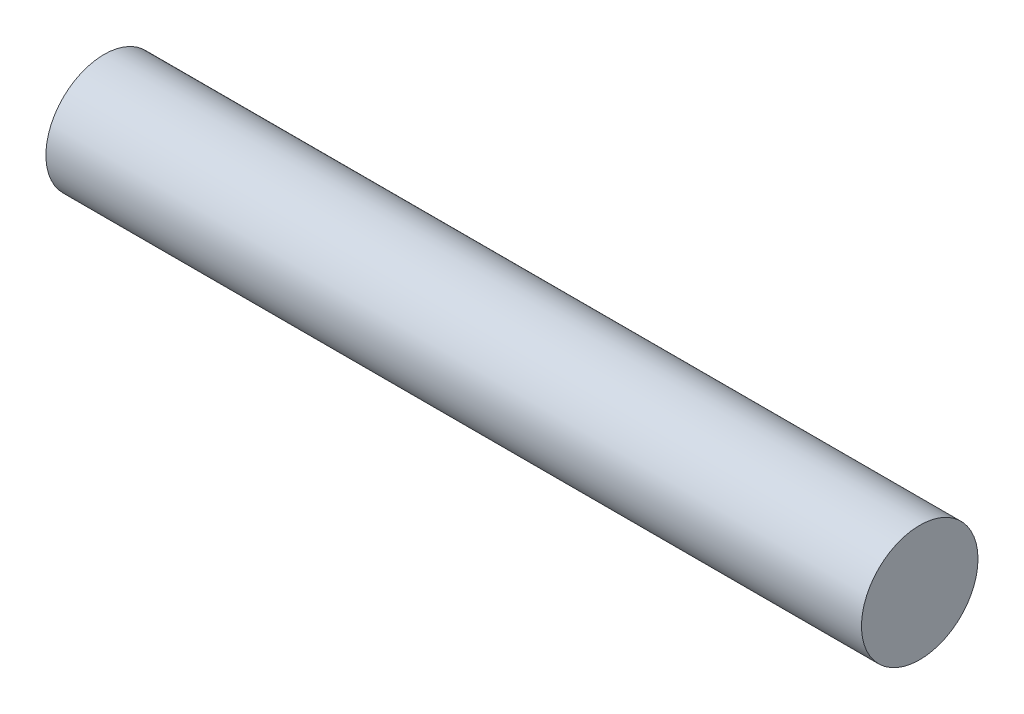
ISO-10303-21;
HEADER;
FILE_DESCRIPTION(('STEP AP214'),'2;1');
FILE_NAME('part.step','',(''),(''),'','','');
FILE_SCHEMA(('AUTOMOTIVE_DESIGN { 1 0 10303 214 1 1 1 1 }'));
ENDSEC;
DATA;
#1=APPLICATION_CONTEXT('core data for automotive mechanical design processes');
#2=APPLICATION_PROTOCOL_DEFINITION('international standard','automotive_design',2000,#1);
#3=PRODUCT_CONTEXT('',#1,'mechanical');
#4=PRODUCT('Part','Part','',(#3));
#5=PRODUCT_RELATED_PRODUCT_CATEGORY('part','',(#4));
#6=PRODUCT_DEFINITION_FORMATION('','',#4);
#7=PRODUCT_DEFINITION_CONTEXT('part definition',#1,'design');
#8=PRODUCT_DEFINITION('design','',#6,#7);
#9=PRODUCT_DEFINITION_SHAPE('','',#8);
#10=(LENGTH_UNIT() NAMED_UNIT(*) SI_UNIT(.MILLI.,.METRE.));
#11=(NAMED_UNIT(*) PLANE_ANGLE_UNIT() SI_UNIT($,.RADIAN.));
#12=(NAMED_UNIT(*) SI_UNIT($,.STERADIAN.) SOLID_ANGLE_UNIT());
#13=UNCERTAINTY_MEASURE_WITH_UNIT(LENGTH_MEASURE(1.E-05),#10,'distance_accuracy_value','');
#14=(GEOMETRIC_REPRESENTATION_CONTEXT(3) GLOBAL_UNCERTAINTY_ASSIGNED_CONTEXT((#13)) GLOBAL_UNIT_ASSIGNED_CONTEXT((#10,
#11,#12)) REPRESENTATION_CONTEXT('',''));
#15=CARTESIAN_POINT('',(0.,0.,0.));
#16=DIRECTION('',(0.,0.,1.));
#17=DIRECTION('',(1.,0.,0.));
#18=AXIS2_PLACEMENT_3D('',#15,#16,#17);
#19=CARTESIAN_POINT('',(44.45,0.,0.));
#20=DIRECTION('',(-1.,0.,0.));
#21=DIRECTION('',(0.,0.,1.));
#22=AXIS2_PLACEMENT_3D('',#19,#20,#21);
#23=CYLINDRICAL_SURFACE('',#22,6.35);
#24=CARTESIAN_POINT('',(44.45,0.,0.));
#25=DIRECTION('',(1.,0.,0.));
#26=DIRECTION('',(0.,0.,-1.));
#27=AXIS2_PLACEMENT_3D('',#24,#25,#26);
#28=CIRCLE('',#27,6.35);
#29=CARTESIAN_POINT('',(44.45,0.,-6.35));
#30=VERTEX_POINT('',#29);
#31=EDGE_CURVE('E10',#30,#30,#28,.T.);
#32=ORIENTED_EDGE('',*,*,#31,.F.);
#33=EDGE_LOOP('',(#32));
#34=FACE_BOUND('',#33,.T.);
#35=CARTESIAN_POINT('',(-44.45,0.,0.));
#36=DIRECTION('',(1.,0.,0.));
#37=DIRECTION('',(0.,0.,-1.));
#38=AXIS2_PLACEMENT_3D('',#35,#36,#37);
#39=CIRCLE('',#38,6.35);
#40=CARTESIAN_POINT('',(-44.45,0.,-6.35));
#41=VERTEX_POINT('',#40);
#42=EDGE_CURVE('E36',#41,#41,#39,.T.);
#43=ORIENTED_EDGE('',*,*,#42,.T.);
#44=EDGE_LOOP('',(#43));
#45=FACE_BOUND('',#44,.T.);
#46=ADVANCED_FACE('F33',(#34,#45),#23,.T.);
#47=CARTESIAN_POINT('',(44.45,0.,0.));
#48=DIRECTION('',(1.,0.,0.));
#49=DIRECTION('',(0.,0.,-1.));
#50=AXIS2_PLACEMENT_3D('',#47,#48,#49);
#51=PLANE('',#50);
#52=ORIENTED_EDGE('',*,*,#31,.T.);
#53=EDGE_LOOP('',(#52));
#54=FACE_BOUND('',#53,.T.);
#55=ADVANCED_FACE('F48',(#54),#51,.T.);
#56=CARTESIAN_POINT('',(-44.45,0.,0.));
#57=DIRECTION('',(1.,0.,0.));
#58=DIRECTION('',(0.,0.,-1.));
#59=AXIS2_PLACEMENT_3D('',#56,#57,#58);
#60=PLANE('',#59);
#61=ORIENTED_EDGE('',*,*,#42,.F.);
#62=EDGE_LOOP('',(#61));
#63=FACE_BOUND('',#62,.T.);
#64=ADVANCED_FACE('F46',(#63),#60,.F.);
#65=CLOSED_SHELL('',(#46,#55,#64));
#66=MANIFOLD_SOLID_BREP('B2',#65);
#67=ADVANCED_BREP_SHAPE_REPRESENTATION('',(#18,#66),#14);
#68=SHAPE_DEFINITION_REPRESENTATION(#9,#67);
ENDSEC;
END-ISO-10303-21;
